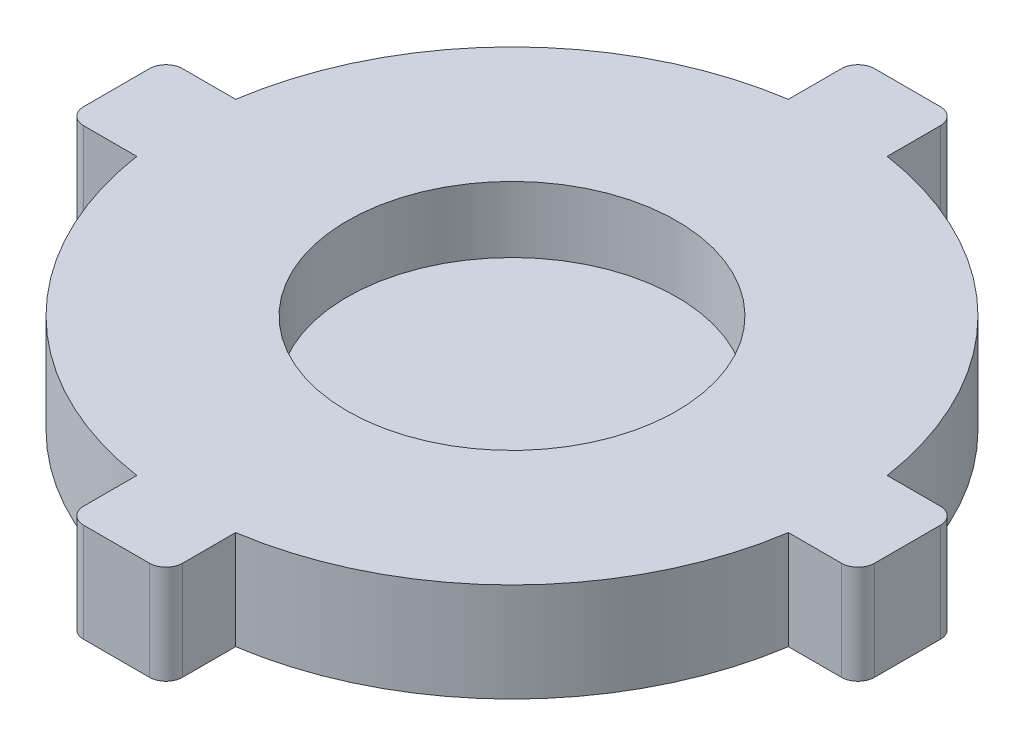
ISO-10303-21;
HEADER;
FILE_DESCRIPTION(('STEP AP214'),'2;1');
FILE_NAME('part.step','',(''),(''),'','','');
FILE_SCHEMA(('AUTOMOTIVE_DESIGN { 1 0 10303 214 1 1 1 1 }'));
ENDSEC;
DATA;
#1=APPLICATION_CONTEXT('core data for automotive mechanical design processes');
#2=APPLICATION_PROTOCOL_DEFINITION('international standard','automotive_design',2000,#1);
#3=PRODUCT_CONTEXT('',#1,'mechanical');
#4=PRODUCT('Part','Part','',(#3));
#5=PRODUCT_RELATED_PRODUCT_CATEGORY('part','',(#4));
#6=PRODUCT_DEFINITION_FORMATION('','',#4);
#7=PRODUCT_DEFINITION_CONTEXT('part definition',#1,'design');
#8=PRODUCT_DEFINITION('design','',#6,#7);
#9=PRODUCT_DEFINITION_SHAPE('','',#8);
#10=(LENGTH_UNIT() NAMED_UNIT(*) SI_UNIT(.MILLI.,.METRE.));
#11=(NAMED_UNIT(*) PLANE_ANGLE_UNIT() SI_UNIT($,.RADIAN.));
#12=(NAMED_UNIT(*) SI_UNIT($,.STERADIAN.) SOLID_ANGLE_UNIT());
#13=UNCERTAINTY_MEASURE_WITH_UNIT(LENGTH_MEASURE(1.E-05),#10,'distance_accuracy_value','');
#14=(GEOMETRIC_REPRESENTATION_CONTEXT(3) GLOBAL_UNCERTAINTY_ASSIGNED_CONTEXT((#13)) GLOBAL_UNIT_ASSIGNED_CONTEXT((#10,
#11,#12)) REPRESENTATION_CONTEXT('',''));
#15=CARTESIAN_POINT('',(0.,0.,0.));
#16=DIRECTION('',(0.,0.,1.));
#17=DIRECTION('',(1.,0.,0.));
#18=AXIS2_PLACEMENT_3D('',#15,#16,#17);
#19=CARTESIAN_POINT('',(0.,30.,0.));
#20=DIRECTION('',(0.,-1.,0.));
#21=DIRECTION('',(0.,0.,-1.));
#22=AXIS2_PLACEMENT_3D('',#19,#20,#21);
#23=CYLINDRICAL_SURFACE('',#22,100.);
#24=CARTESIAN_POINT('',(0.,0.,0.));
#25=DIRECTION('',(0.,1.,0.));
#26=DIRECTION('',(0.,0.,1.));
#27=AXIS2_PLACEMENT_3D('',#24,#25,#26);
#28=CIRCLE('',#27,100.);
#29=CARTESIAN_POINT('',(-98.8685996664261,0.,14.999999999999));
#30=VERTEX_POINT('',#29);
#31=CARTESIAN_POINT('',(-15.0000000000007,0.,98.8685996664259));
#32=VERTEX_POINT('',#31);
#33=EDGE_CURVE('E233',#30,#32,#28,.T.);
#34=ORIENTED_EDGE('',*,*,#33,.T.);
#35=DIRECTION('',(0.,-1.,0.));
#36=VECTOR('',#35,1.);
#37=CARTESIAN_POINT('',(-15.0000000000007,30.,98.8685996664259));
#38=LINE('',#37,#36);
#39=CARTESIAN_POINT('',(-15.0000000000007,30.,98.8685996664259));
#40=VERTEX_POINT('',#39);
#41=EDGE_CURVE('E45',#40,#32,#38,.T.);
#42=ORIENTED_EDGE('',*,*,#41,.F.);
#43=CARTESIAN_POINT('',(0.,30.,0.));
#44=DIRECTION('',(0.,1.,0.));
#45=DIRECTION('',(0.,0.,1.));
#46=AXIS2_PLACEMENT_3D('',#43,#44,#45);
#47=CIRCLE('',#46,100.);
#48=CARTESIAN_POINT('',(-98.8685996664261,30.,14.999999999999));
#49=VERTEX_POINT('',#48);
#50=EDGE_CURVE('E139',#49,#40,#47,.T.);
#51=ORIENTED_EDGE('',*,*,#50,.F.);
#52=DIRECTION('',(0.,-1.,0.));
#53=VECTOR('',#52,1.);
#54=CARTESIAN_POINT('',(-98.8685996664261,30.,14.999999999999));
#55=LINE('',#54,#53);
#56=EDGE_CURVE('E53',#49,#30,#55,.T.);
#57=ORIENTED_EDGE('',*,*,#56,.T.);
#58=EDGE_LOOP('',(#34,#42,#51,#57));
#59=FACE_BOUND('',#58,.T.);
#60=ADVANCED_FACE('F37',(#59),#23,.T.);
#61=CARTESIAN_POINT('',(-15.,30.,-1.02454893928513E-13));
#62=DIRECTION('',(-1.,0.,0.));
#63=DIRECTION('',(0.,0.,1.));
#64=AXIS2_PLACEMENT_3D('',#61,#62,#63);
#65=PLANE('',#64);
#66=DIRECTION('',(0.,0.,-1.));
#67=VECTOR('',#66,1.);
#68=CARTESIAN_POINT('',(-15.,0.,-1.02454893928513E-13));
#69=LINE('',#68,#67);
#70=CARTESIAN_POINT('',(-15.0000000000008,0.,115.));
#71=VERTEX_POINT('',#70);
#72=EDGE_CURVE('E235',#71,#32,#69,.T.);
#73=ORIENTED_EDGE('',*,*,#72,.F.);
#74=DIRECTION('',(0.,-1.,0.));
#75=VECTOR('',#74,1.);
#76=CARTESIAN_POINT('',(-15.0000000000008,30.,115.));
#77=LINE('',#76,#75);
#78=CARTESIAN_POINT('',(-15.0000000000008,30.,115.));
#79=VERTEX_POINT('',#78);
#80=EDGE_CURVE('E340',#79,#71,#77,.T.);
#81=ORIENTED_EDGE('',*,*,#80,.F.);
#82=DIRECTION('',(0.,0.,-1.));
#83=VECTOR('',#82,1.);
#84=CARTESIAN_POINT('',(-15.,30.,-1.02454893928513E-13));
#85=LINE('',#84,#83);
#86=EDGE_CURVE('E345',#79,#40,#85,.T.);
#87=ORIENTED_EDGE('',*,*,#86,.T.);
#88=ORIENTED_EDGE('',*,*,#41,.T.);
#89=EDGE_LOOP('',(#73,#81,#87,#88));
#90=FACE_BOUND('',#89,.T.);
#91=ADVANCED_FACE('F344',(#90),#65,.T.);
#92=CARTESIAN_POINT('',(-10.0000000000008,30.,115.));
#93=DIRECTION('',(0.,-1.,0.));
#94=DIRECTION('',(0.,0.,-1.));
#95=AXIS2_PLACEMENT_3D('',#92,#93,#94);
#96=CYLINDRICAL_SURFACE('',#95,5.);
#97=CARTESIAN_POINT('',(-10.0000000000008,0.,115.));
#98=DIRECTION('',(0.,1.,0.));
#99=DIRECTION('',(0.,0.,1.));
#100=AXIS2_PLACEMENT_3D('',#97,#98,#99);
#101=CIRCLE('',#100,5.);
#102=CARTESIAN_POINT('',(-10.0000000000008,0.,120.));
#103=VERTEX_POINT('',#102);
#104=EDGE_CURVE('E238',#103,#71,#101,.F.);
#105=ORIENTED_EDGE('',*,*,#104,.F.);
#106=DIRECTION('',(0.,-1.,0.));
#107=VECTOR('',#106,1.);
#108=CARTESIAN_POINT('',(-10.0000000000008,30.,120.));
#109=LINE('',#108,#107);
#110=CARTESIAN_POINT('',(-10.0000000000008,30.,120.));
#111=VERTEX_POINT('',#110);
#112=EDGE_CURVE('E338',#111,#103,#109,.T.);
#113=ORIENTED_EDGE('',*,*,#112,.F.);
#114=CARTESIAN_POINT('',(-10.0000000000008,30.,115.));
#115=DIRECTION('',(0.,1.,0.));
#116=DIRECTION('',(0.,0.,1.));
#117=AXIS2_PLACEMENT_3D('',#114,#115,#116);
#118=CIRCLE('',#117,5.);
#119=EDGE_CURVE('E354',#111,#79,#118,.F.);
#120=ORIENTED_EDGE('',*,*,#119,.T.);
#121=ORIENTED_EDGE('',*,*,#80,.T.);
#122=EDGE_LOOP('',(#105,#113,#120,#121));
#123=FACE_BOUND('',#122,.T.);
#124=ADVANCED_FACE('F351',(#123),#96,.T.);
#125=CARTESIAN_POINT('',(-8.32667268468871E-13,30.,120.));
#126=DIRECTION('',(0.,0.,1.));
#127=DIRECTION('',(1.,0.,0.));
#128=AXIS2_PLACEMENT_3D('',#125,#126,#127);
#129=PLANE('',#128);
#130=DIRECTION('',(-1.,0.,0.));
#131=VECTOR('',#130,1.);
#132=CARTESIAN_POINT('',(-8.32667268468871E-13,0.,120.));
#133=LINE('',#132,#131);
#134=CARTESIAN_POINT('',(9.99999999999912,0.,120.));
#135=VERTEX_POINT('',#134);
#136=EDGE_CURVE('E241',#135,#103,#133,.T.);
#137=ORIENTED_EDGE('',*,*,#136,.F.);
#138=DIRECTION('',(0.,-1.,0.));
#139=VECTOR('',#138,1.);
#140=CARTESIAN_POINT('',(9.99999999999912,30.,120.));
#141=LINE('',#140,#139);
#142=CARTESIAN_POINT('',(9.99999999999912,30.,120.));
#143=VERTEX_POINT('',#142);
#144=EDGE_CURVE('E336',#143,#135,#141,.T.);
#145=ORIENTED_EDGE('',*,*,#144,.F.);
#146=DIRECTION('',(-1.,0.,0.));
#147=VECTOR('',#146,1.);
#148=CARTESIAN_POINT('',(-8.32667268468871E-13,30.,120.));
#149=LINE('',#148,#147);
#150=EDGE_CURVE('E358',#143,#111,#149,.T.);
#151=ORIENTED_EDGE('',*,*,#150,.T.);
#152=ORIENTED_EDGE('',*,*,#112,.T.);
#153=EDGE_LOOP('',(#137,#145,#151,#152));
#154=FACE_BOUND('',#153,.T.);
#155=ADVANCED_FACE('F429',(#154),#129,.T.);
#156=CARTESIAN_POINT('',(9.99999999999919,30.,115.));
#157=DIRECTION('',(0.,-1.,0.));
#158=DIRECTION('',(0.,0.,-1.));
#159=AXIS2_PLACEMENT_3D('',#156,#157,#158);
#160=CYLINDRICAL_SURFACE('',#159,5.);
#161=CARTESIAN_POINT('',(9.99999999999919,0.,115.));
#162=DIRECTION('',(0.,1.,0.));
#163=DIRECTION('',(0.,0.,1.));
#164=AXIS2_PLACEMENT_3D('',#161,#162,#163);
#165=CIRCLE('',#164,5.);
#166=CARTESIAN_POINT('',(14.9999999999992,0.,115.));
#167=VERTEX_POINT('',#166);
#168=EDGE_CURVE('E244',#167,#135,#165,.F.);
#169=ORIENTED_EDGE('',*,*,#168,.F.);
#170=DIRECTION('',(0.,-1.,0.));
#171=VECTOR('',#170,1.);
#172=CARTESIAN_POINT('',(14.9999999999992,30.,115.));
#173=LINE('',#172,#171);
#174=CARTESIAN_POINT('',(14.9999999999992,30.,115.));
#175=VERTEX_POINT('',#174);
#176=EDGE_CURVE('E334',#175,#167,#173,.T.);
#177=ORIENTED_EDGE('',*,*,#176,.F.);
#178=CARTESIAN_POINT('',(9.99999999999919,30.,115.));
#179=DIRECTION('',(0.,1.,0.));
#180=DIRECTION('',(0.,0.,1.));
#181=AXIS2_PLACEMENT_3D('',#178,#179,#180);
#182=CIRCLE('',#181,5.);
#183=EDGE_CURVE('E363',#175,#143,#182,.F.);
#184=ORIENTED_EDGE('',*,*,#183,.T.);
#185=ORIENTED_EDGE('',*,*,#144,.T.);
#186=EDGE_LOOP('',(#169,#177,#184,#185));
#187=FACE_BOUND('',#186,.T.);
#188=ADVANCED_FACE('F434',(#187),#160,.T.);
#189=CARTESIAN_POINT('',(15.,30.,1.04774627375951E-13));
#190=DIRECTION('',(1.,0.,0.));
#191=DIRECTION('',(0.,0.,-1.));
#192=AXIS2_PLACEMENT_3D('',#189,#190,#191);
#193=PLANE('',#192);
#194=DIRECTION('',(0.,0.,1.));
#195=VECTOR('',#194,1.);
#196=CARTESIAN_POINT('',(15.,0.,1.04774627375951E-13));
#197=LINE('',#196,#195);
#198=CARTESIAN_POINT('',(14.9999999999993,0.,98.8685996664261));
#199=VERTEX_POINT('',#198);
#200=EDGE_CURVE('E247',#199,#167,#197,.T.);
#201=ORIENTED_EDGE('',*,*,#200,.F.);
#202=DIRECTION('',(0.,-1.,0.));
#203=VECTOR('',#202,1.);
#204=CARTESIAN_POINT('',(14.9999999999993,30.,98.8685996664261));
#205=LINE('',#204,#203);
#206=CARTESIAN_POINT('',(14.9999999999993,30.,98.8685996664261));
#207=VERTEX_POINT('',#206);
#208=EDGE_CURVE('E332',#207,#199,#205,.T.);
#209=ORIENTED_EDGE('',*,*,#208,.F.);
#210=DIRECTION('',(0.,0.,1.));
#211=VECTOR('',#210,1.);
#212=CARTESIAN_POINT('',(15.,30.,1.04774627375951E-13));
#213=LINE('',#212,#211);
#214=EDGE_CURVE('E366',#207,#175,#213,.T.);
#215=ORIENTED_EDGE('',*,*,#214,.T.);
#216=ORIENTED_EDGE('',*,*,#176,.T.);
#217=EDGE_LOOP('',(#201,#209,#215,#216));
#218=FACE_BOUND('',#217,.T.);
#219=ADVANCED_FACE('F438',(#218),#193,.T.);
#220=CARTESIAN_POINT('',(0.,30.,0.));
#221=DIRECTION('',(0.,-1.,0.));
#222=DIRECTION('',(0.,0.,-1.));
#223=AXIS2_PLACEMENT_3D('',#220,#221,#222);
#224=CYLINDRICAL_SURFACE('',#223,100.);
#225=CARTESIAN_POINT('',(0.,0.,0.));
#226=DIRECTION('',(0.,1.,0.));
#227=DIRECTION('',(0.,0.,1.));
#228=AXIS2_PLACEMENT_3D('',#225,#226,#227);
#229=CIRCLE('',#228,100.);
#230=CARTESIAN_POINT('',(98.8685996664259,0.,15.0000000000003));
#231=VERTEX_POINT('',#230);
#232=EDGE_CURVE('E250',#199,#231,#229,.T.);
#233=ORIENTED_EDGE('',*,*,#232,.T.);
#234=DIRECTION('',(0.,-1.,0.));
#235=VECTOR('',#234,1.);
#236=CARTESIAN_POINT('',(98.8685996664259,30.,15.0000000000003));
#237=LINE('',#236,#235);
#238=CARTESIAN_POINT('',(98.8685996664259,30.,15.0000000000003));
#239=VERTEX_POINT('',#238);
#240=EDGE_CURVE('E330',#239,#231,#237,.T.);
#241=ORIENTED_EDGE('',*,*,#240,.F.);
#242=CARTESIAN_POINT('',(0.,30.,0.));
#243=DIRECTION('',(0.,1.,0.));
#244=DIRECTION('',(0.,0.,1.));
#245=AXIS2_PLACEMENT_3D('',#242,#243,#244);
#246=CIRCLE('',#245,100.);
#247=EDGE_CURVE('E369',#207,#239,#246,.T.);
#248=ORIENTED_EDGE('',*,*,#247,.F.);
#249=ORIENTED_EDGE('',*,*,#208,.T.);
#250=EDGE_LOOP('',(#233,#241,#248,#249));
#251=FACE_BOUND('',#250,.T.);
#252=ADVANCED_FACE('F442',(#251),#224,.T.);
#253=CARTESIAN_POINT('',(0.,30.,15.));
#254=DIRECTION('',(0.,0.,1.));
#255=DIRECTION('',(1.,0.,0.));
#256=AXIS2_PLACEMENT_3D('',#253,#254,#255);
#257=PLANE('',#256);
#258=DIRECTION('',(-1.,0.,0.));
#259=VECTOR('',#258,1.);
#260=CARTESIAN_POINT('',(0.,0.,15.));
#261=LINE('',#260,#259);
#262=CARTESIAN_POINT('',(115.,0.,15.0000000000004));
#263=VERTEX_POINT('',#262);
#264=EDGE_CURVE('E253',#263,#231,#261,.T.);
#265=ORIENTED_EDGE('',*,*,#264,.F.);
#266=DIRECTION('',(0.,-1.,0.));
#267=VECTOR('',#266,1.);
#268=CARTESIAN_POINT('',(115.,30.,15.0000000000004));
#269=LINE('',#268,#267);
#270=CARTESIAN_POINT('',(115.,30.,15.0000000000004));
#271=VERTEX_POINT('',#270);
#272=EDGE_CURVE('E328',#271,#263,#269,.T.);
#273=ORIENTED_EDGE('',*,*,#272,.F.);
#274=DIRECTION('',(-1.,0.,0.));
#275=VECTOR('',#274,1.);
#276=CARTESIAN_POINT('',(0.,30.,15.));
#277=LINE('',#276,#275);
#278=EDGE_CURVE('E371',#271,#239,#277,.T.);
#279=ORIENTED_EDGE('',*,*,#278,.T.);
#280=ORIENTED_EDGE('',*,*,#240,.T.);
#281=EDGE_LOOP('',(#265,#273,#279,#280));
#282=FACE_BOUND('',#281,.T.);
#283=ADVANCED_FACE('F446',(#282),#257,.T.);
#284=CARTESIAN_POINT('',(115.,30.,10.0000000000004));
#285=DIRECTION('',(0.,-1.,0.));
#286=DIRECTION('',(0.,0.,-1.));
#287=AXIS2_PLACEMENT_3D('',#284,#285,#286);
#288=CYLINDRICAL_SURFACE('',#287,5.);
#289=CARTESIAN_POINT('',(115.,0.,10.0000000000004));
#290=DIRECTION('',(0.,1.,0.));
#291=DIRECTION('',(0.,0.,1.));
#292=AXIS2_PLACEMENT_3D('',#289,#290,#291);
#293=CIRCLE('',#292,5.);
#294=CARTESIAN_POINT('',(120.,0.,10.0000000000004));
#295=VERTEX_POINT('',#294);
#296=EDGE_CURVE('E256',#295,#263,#293,.F.);
#297=ORIENTED_EDGE('',*,*,#296,.F.);
#298=DIRECTION('',(0.,-1.,0.));
#299=VECTOR('',#298,1.);
#300=CARTESIAN_POINT('',(120.,30.,10.0000000000004));
#301=LINE('',#300,#299);
#302=CARTESIAN_POINT('',(120.,30.,10.0000000000004));
#303=VERTEX_POINT('',#302);
#304=EDGE_CURVE('E326',#303,#295,#301,.T.);
#305=ORIENTED_EDGE('',*,*,#304,.F.);
#306=CARTESIAN_POINT('',(115.,30.,10.0000000000004));
#307=DIRECTION('',(0.,1.,0.));
#308=DIRECTION('',(0.,0.,1.));
#309=AXIS2_PLACEMENT_3D('',#306,#307,#308);
#310=CIRCLE('',#309,5.);
#311=EDGE_CURVE('E374',#303,#271,#310,.F.);
#312=ORIENTED_EDGE('',*,*,#311,.T.);
#313=ORIENTED_EDGE('',*,*,#272,.T.);
#314=EDGE_LOOP('',(#297,#305,#312,#313));
#315=FACE_BOUND('',#314,.T.);
#316=ADVANCED_FACE('F450',(#315),#288,.T.);
#317=CARTESIAN_POINT('',(120.,30.,4.99600361081323E-13));
#318=DIRECTION('',(1.,0.,0.));
#319=DIRECTION('',(0.,0.,-1.));
#320=AXIS2_PLACEMENT_3D('',#317,#318,#319);
#321=PLANE('',#320);
#322=DIRECTION('',(0.,0.,1.));
#323=VECTOR('',#322,1.);
#324=CARTESIAN_POINT('',(120.,0.,4.99600361081323E-13));
#325=LINE('',#324,#323);
#326=CARTESIAN_POINT('',(120.,0.,-9.99999999999954));
#327=VERTEX_POINT('',#326);
#328=EDGE_CURVE('E259',#327,#295,#325,.T.);
#329=ORIENTED_EDGE('',*,*,#328,.F.);
#330=DIRECTION('',(0.,-1.,0.));
#331=VECTOR('',#330,1.);
#332=CARTESIAN_POINT('',(120.,30.,-9.99999999999954));
#333=LINE('',#332,#331);
#334=CARTESIAN_POINT('',(120.,30.,-9.99999999999954));
#335=VERTEX_POINT('',#334);
#336=EDGE_CURVE('E324',#335,#327,#333,.T.);
#337=ORIENTED_EDGE('',*,*,#336,.F.);
#338=DIRECTION('',(0.,0.,1.));
#339=VECTOR('',#338,1.);
#340=CARTESIAN_POINT('',(120.,30.,4.99600361081323E-13));
#341=LINE('',#340,#339);
#342=EDGE_CURVE('E377',#335,#303,#341,.T.);
#343=ORIENTED_EDGE('',*,*,#342,.T.);
#344=ORIENTED_EDGE('',*,*,#304,.T.);
#345=EDGE_LOOP('',(#329,#337,#343,#344));
#346=FACE_BOUND('',#345,.T.);
#347=ADVANCED_FACE('F454',(#346),#321,.T.);
#348=CARTESIAN_POINT('',(115.,30.,-9.99999999999959));
#349=DIRECTION('',(0.,-1.,0.));
#350=DIRECTION('',(0.,0.,-1.));
#351=AXIS2_PLACEMENT_3D('',#348,#349,#350);
#352=CYLINDRICAL_SURFACE('',#351,5.);
#353=CARTESIAN_POINT('',(115.,0.,-9.99999999999959));
#354=DIRECTION('',(0.,1.,0.));
#355=DIRECTION('',(0.,0.,1.));
#356=AXIS2_PLACEMENT_3D('',#353,#354,#355);
#357=CIRCLE('',#356,5.);
#358=CARTESIAN_POINT('',(115.,0.,-14.9999999999996));
#359=VERTEX_POINT('',#358);
#360=EDGE_CURVE('E262',#359,#327,#357,.F.);
#361=ORIENTED_EDGE('',*,*,#360,.F.);
#362=DIRECTION('',(0.,-1.,0.));
#363=VECTOR('',#362,1.);
#364=CARTESIAN_POINT('',(115.,30.,-14.9999999999996));
#365=LINE('',#364,#363);
#366=CARTESIAN_POINT('',(115.,30.,-14.9999999999996));
#367=VERTEX_POINT('',#366);
#368=EDGE_CURVE('E322',#367,#359,#365,.T.);
#369=ORIENTED_EDGE('',*,*,#368,.F.);
#370=CARTESIAN_POINT('',(115.,30.,-9.99999999999959));
#371=DIRECTION('',(0.,1.,0.));
#372=DIRECTION('',(0.,0.,1.));
#373=AXIS2_PLACEMENT_3D('',#370,#371,#372);
#374=CIRCLE('',#373,5.);
#375=EDGE_CURVE('E380',#367,#335,#374,.F.);
#376=ORIENTED_EDGE('',*,*,#375,.T.);
#377=ORIENTED_EDGE('',*,*,#336,.T.);
#378=EDGE_LOOP('',(#361,#369,#376,#377));
#379=FACE_BOUND('',#378,.T.);
#380=ADVANCED_FACE('F458',(#379),#352,.T.);
#381=CARTESIAN_POINT('',(0.,30.,-15.));
#382=DIRECTION('',(0.,0.,-1.));
#383=DIRECTION('',(-1.,0.,0.));
#384=AXIS2_PLACEMENT_3D('',#381,#382,#383);
#385=PLANE('',#384);
#386=DIRECTION('',(1.,0.,0.));
#387=VECTOR('',#386,1.);
#388=CARTESIAN_POINT('',(0.,0.,-15.));
#389=LINE('',#388,#387);
#390=CARTESIAN_POINT('',(98.868599666426,0.,-14.9999999999996));
#391=VERTEX_POINT('',#390);
#392=EDGE_CURVE('E265',#391,#359,#389,.T.);
#393=ORIENTED_EDGE('',*,*,#392,.F.);
#394=DIRECTION('',(0.,-1.,0.));
#395=VECTOR('',#394,1.);
#396=CARTESIAN_POINT('',(98.868599666426,30.,-14.9999999999996));
#397=LINE('',#396,#395);
#398=CARTESIAN_POINT('',(98.868599666426,30.,-14.9999999999996));
#399=VERTEX_POINT('',#398);
#400=EDGE_CURVE('E320',#399,#391,#397,.T.);
#401=ORIENTED_EDGE('',*,*,#400,.F.);
#402=DIRECTION('',(1.,0.,0.));
#403=VECTOR('',#402,1.);
#404=CARTESIAN_POINT('',(0.,30.,-15.));
#405=LINE('',#404,#403);
#406=EDGE_CURVE('E383',#399,#367,#405,.T.);
#407=ORIENTED_EDGE('',*,*,#406,.T.);
#408=ORIENTED_EDGE('',*,*,#368,.T.);
#409=EDGE_LOOP('',(#393,#401,#407,#408));
#410=FACE_BOUND('',#409,.T.);
#411=ADVANCED_FACE('F462',(#410),#385,.T.);
#412=CARTESIAN_POINT('',(0.,30.,0.));
#413=DIRECTION('',(0.,-1.,0.));
#414=DIRECTION('',(0.,0.,-1.));
#415=AXIS2_PLACEMENT_3D('',#412,#413,#414);
#416=CYLINDRICAL_SURFACE('',#415,100.);
#417=CARTESIAN_POINT('',(0.,0.,0.));
#418=DIRECTION('',(0.,1.,0.));
#419=DIRECTION('',(0.,0.,1.));
#420=AXIS2_PLACEMENT_3D('',#417,#418,#419);
#421=CIRCLE('',#420,100.);
#422=CARTESIAN_POINT('',(15.,0.,-98.868599666426));
#423=VERTEX_POINT('',#422);
#424=EDGE_CURVE('E268',#391,#423,#421,.T.);
#425=ORIENTED_EDGE('',*,*,#424,.T.);
#426=DIRECTION('',(0.,-1.,0.));
#427=VECTOR('',#426,1.);
#428=CARTESIAN_POINT('',(15.,30.,-98.868599666426));
#429=LINE('',#428,#427);
#430=CARTESIAN_POINT('',(15.,30.,-98.868599666426));
#431=VERTEX_POINT('',#430);
#432=EDGE_CURVE('E318',#431,#423,#429,.T.);
#433=ORIENTED_EDGE('',*,*,#432,.F.);
#434=CARTESIAN_POINT('',(0.,30.,0.));
#435=DIRECTION('',(0.,1.,0.));
#436=DIRECTION('',(0.,0.,1.));
#437=AXIS2_PLACEMENT_3D('',#434,#435,#436);
#438=CIRCLE('',#437,100.);
#439=EDGE_CURVE('E386',#399,#431,#438,.T.);
#440=ORIENTED_EDGE('',*,*,#439,.F.);
#441=ORIENTED_EDGE('',*,*,#400,.T.);
#442=EDGE_LOOP('',(#425,#433,#440,#441));
#443=FACE_BOUND('',#442,.T.);
#444=ADVANCED_FACE('F466',(#443),#416,.T.);
#445=CARTESIAN_POINT('',(15.,30.,0.));
#446=DIRECTION('',(1.,0.,0.));
#447=DIRECTION('',(0.,0.,-1.));
#448=AXIS2_PLACEMENT_3D('',#445,#446,#447);
#449=PLANE('',#448);
#450=DIRECTION('',(0.,0.,1.));
#451=VECTOR('',#450,1.);
#452=CARTESIAN_POINT('',(15.,0.,0.));
#453=LINE('',#452,#451);
#454=CARTESIAN_POINT('',(15.,0.,-115.));
#455=VERTEX_POINT('',#454);
#456=EDGE_CURVE('E271',#455,#423,#453,.T.);
#457=ORIENTED_EDGE('',*,*,#456,.F.);
#458=DIRECTION('',(0.,-1.,0.));
#459=VECTOR('',#458,1.);
#460=CARTESIAN_POINT('',(15.,30.,-115.));
#461=LINE('',#460,#459);
#462=CARTESIAN_POINT('',(15.,30.,-115.));
#463=VERTEX_POINT('',#462);
#464=EDGE_CURVE('E316',#463,#455,#461,.T.);
#465=ORIENTED_EDGE('',*,*,#464,.F.);
#466=DIRECTION('',(0.,0.,1.));
#467=VECTOR('',#466,1.);
#468=CARTESIAN_POINT('',(15.,30.,0.));
#469=LINE('',#468,#467);
#470=EDGE_CURVE('E388',#463,#431,#469,.T.);
#471=ORIENTED_EDGE('',*,*,#470,.T.);
#472=ORIENTED_EDGE('',*,*,#432,.T.);
#473=EDGE_LOOP('',(#457,#465,#471,#472));
#474=FACE_BOUND('',#473,.T.);
#475=ADVANCED_FACE('F470',(#474),#449,.T.);
#476=CARTESIAN_POINT('',(10.,30.,-115.));
#477=DIRECTION('',(0.,-1.,0.));
#478=DIRECTION('',(0.,0.,-1.));
#479=AXIS2_PLACEMENT_3D('',#476,#477,#478);
#480=CYLINDRICAL_SURFACE('',#479,5.);
#481=CARTESIAN_POINT('',(10.,0.,-115.));
#482=DIRECTION('',(0.,1.,0.));
#483=DIRECTION('',(0.,0.,1.));
#484=AXIS2_PLACEMENT_3D('',#481,#482,#483);
#485=CIRCLE('',#484,5.);
#486=CARTESIAN_POINT('',(9.99999999999996,0.,-120.));
#487=VERTEX_POINT('',#486);
#488=EDGE_CURVE('E274',#487,#455,#485,.F.);
#489=ORIENTED_EDGE('',*,*,#488,.F.);
#490=DIRECTION('',(0.,-1.,0.));
#491=VECTOR('',#490,1.);
#492=CARTESIAN_POINT('',(9.99999999999996,30.,-120.));
#493=LINE('',#492,#491);
#494=CARTESIAN_POINT('',(9.99999999999996,30.,-120.));
#495=VERTEX_POINT('',#494);
#496=EDGE_CURVE('E314',#495,#487,#493,.T.);
#497=ORIENTED_EDGE('',*,*,#496,.F.);
#498=CARTESIAN_POINT('',(10.,30.,-115.));
#499=DIRECTION('',(0.,1.,0.));
#500=DIRECTION('',(0.,0.,1.));
#501=AXIS2_PLACEMENT_3D('',#498,#499,#500);
#502=CIRCLE('',#501,5.);
#503=EDGE_CURVE('E391',#495,#463,#502,.F.);
#504=ORIENTED_EDGE('',*,*,#503,.T.);
#505=ORIENTED_EDGE('',*,*,#464,.T.);
#506=EDGE_LOOP('',(#489,#497,#504,#505));
#507=FACE_BOUND('',#506,.T.);
#508=ADVANCED_FACE('F474',(#507),#480,.T.);
#509=CARTESIAN_POINT('',(0.,30.,-120.));
#510=DIRECTION('',(0.,0.,-1.));
#511=DIRECTION('',(-1.,0.,0.));
#512=AXIS2_PLACEMENT_3D('',#509,#510,#511);
#513=PLANE('',#512);
#514=DIRECTION('',(1.,0.,0.));
#515=VECTOR('',#514,1.);
#516=CARTESIAN_POINT('',(0.,0.,-120.));
#517=LINE('',#516,#515);
#518=CARTESIAN_POINT('',(-9.99999999999996,0.,-120.));
#519=VERTEX_POINT('',#518);
#520=EDGE_CURVE('E277',#519,#487,#517,.T.);
#521=ORIENTED_EDGE('',*,*,#520,.F.);
#522=DIRECTION('',(0.,-1.,0.));
#523=VECTOR('',#522,1.);
#524=CARTESIAN_POINT('',(-9.99999999999996,30.,-120.));
#525=LINE('',#524,#523);
#526=CARTESIAN_POINT('',(-9.99999999999996,30.,-120.));
#527=VERTEX_POINT('',#526);
#528=EDGE_CURVE('E312',#527,#519,#525,.T.);
#529=ORIENTED_EDGE('',*,*,#528,.F.);
#530=DIRECTION('',(1.,0.,0.));
#531=VECTOR('',#530,1.);
#532=CARTESIAN_POINT('',(0.,30.,-120.));
#533=LINE('',#532,#531);
#534=EDGE_CURVE('E394',#527,#495,#533,.T.);
#535=ORIENTED_EDGE('',*,*,#534,.T.);
#536=ORIENTED_EDGE('',*,*,#496,.T.);
#537=EDGE_LOOP('',(#521,#529,#535,#536));
#538=FACE_BOUND('',#537,.T.);
#539=ADVANCED_FACE('F478',(#538),#513,.T.);
#540=CARTESIAN_POINT('',(-9.99999999999999,30.,-115.));
#541=DIRECTION('',(0.,-1.,0.));
#542=DIRECTION('',(0.,0.,-1.));
#543=AXIS2_PLACEMENT_3D('',#540,#541,#542);
#544=CYLINDRICAL_SURFACE('',#543,5.);
#545=CARTESIAN_POINT('',(-9.99999999999999,0.,-115.));
#546=DIRECTION('',(0.,1.,0.));
#547=DIRECTION('',(0.,0.,1.));
#548=AXIS2_PLACEMENT_3D('',#545,#546,#547);
#549=CIRCLE('',#548,5.);
#550=CARTESIAN_POINT('',(-15.,0.,-115.));
#551=VERTEX_POINT('',#550);
#552=EDGE_CURVE('E280',#551,#519,#549,.F.);
#553=ORIENTED_EDGE('',*,*,#552,.F.);
#554=DIRECTION('',(0.,-1.,0.));
#555=VECTOR('',#554,1.);
#556=CARTESIAN_POINT('',(-15.,30.,-115.));
#557=LINE('',#556,#555);
#558=CARTESIAN_POINT('',(-15.,30.,-115.));
#559=VERTEX_POINT('',#558);
#560=EDGE_CURVE('E310',#559,#551,#557,.T.);
#561=ORIENTED_EDGE('',*,*,#560,.F.);
#562=CARTESIAN_POINT('',(-9.99999999999999,30.,-115.));
#563=DIRECTION('',(0.,1.,0.));
#564=DIRECTION('',(0.,0.,1.));
#565=AXIS2_PLACEMENT_3D('',#562,#563,#564);
#566=CIRCLE('',#565,5.);
#567=EDGE_CURVE('E397',#559,#527,#566,.F.);
#568=ORIENTED_EDGE('',*,*,#567,.T.);
#569=ORIENTED_EDGE('',*,*,#528,.T.);
#570=EDGE_LOOP('',(#553,#561,#568,#569));
#571=FACE_BOUND('',#570,.T.);
#572=ADVANCED_FACE('F482',(#571),#544,.T.);
#573=CARTESIAN_POINT('',(-15.,30.,0.));
#574=DIRECTION('',(-1.,0.,0.));
#575=DIRECTION('',(0.,0.,1.));
#576=AXIS2_PLACEMENT_3D('',#573,#574,#575);
#577=PLANE('',#576);
#578=DIRECTION('',(0.,0.,-1.));
#579=VECTOR('',#578,1.);
#580=CARTESIAN_POINT('',(-15.,0.,0.));
#581=LINE('',#580,#579);
#582=CARTESIAN_POINT('',(-15.,0.,-98.868599666426));
#583=VERTEX_POINT('',#582);
#584=EDGE_CURVE('E283',#583,#551,#581,.T.);
#585=ORIENTED_EDGE('',*,*,#584,.F.);
#586=DIRECTION('',(0.,-1.,0.));
#587=VECTOR('',#586,1.);
#588=CARTESIAN_POINT('',(-15.,30.,-98.868599666426));
#589=LINE('',#588,#587);
#590=CARTESIAN_POINT('',(-15.,30.,-98.868599666426));
#591=VERTEX_POINT('',#590);
#592=EDGE_CURVE('E308',#591,#583,#589,.T.);
#593=ORIENTED_EDGE('',*,*,#592,.F.);
#594=DIRECTION('',(0.,0.,-1.));
#595=VECTOR('',#594,1.);
#596=CARTESIAN_POINT('',(-15.,30.,0.));
#597=LINE('',#596,#595);
#598=EDGE_CURVE('E400',#591,#559,#597,.T.);
#599=ORIENTED_EDGE('',*,*,#598,.T.);
#600=ORIENTED_EDGE('',*,*,#560,.T.);
#601=EDGE_LOOP('',(#585,#593,#599,#600));
#602=FACE_BOUND('',#601,.T.);
#603=ADVANCED_FACE('F486',(#602),#577,.T.);
#604=CARTESIAN_POINT('',(0.,30.,0.));
#605=DIRECTION('',(0.,-1.,0.));
#606=DIRECTION('',(0.,0.,-1.));
#607=AXIS2_PLACEMENT_3D('',#604,#605,#606);
#608=CYLINDRICAL_SURFACE('',#607,100.);
#609=CARTESIAN_POINT('',(0.,0.,0.));
#610=DIRECTION('',(0.,1.,0.));
#611=DIRECTION('',(0.,0.,1.));
#612=AXIS2_PLACEMENT_3D('',#609,#610,#611);
#613=CIRCLE('',#612,100.);
#614=CARTESIAN_POINT('',(-98.8685996664258,0.,-15.000000000001));
#615=VERTEX_POINT('',#614);
#616=EDGE_CURVE('E286',#583,#615,#613,.T.);
#617=ORIENTED_EDGE('',*,*,#616,.T.);
#618=DIRECTION('',(0.,-1.,0.));
#619=VECTOR('',#618,1.);
#620=CARTESIAN_POINT('',(-98.8685996664258,30.,-15.000000000001));
#621=LINE('',#620,#619);
#622=CARTESIAN_POINT('',(-98.8685996664258,30.,-15.000000000001));
#623=VERTEX_POINT('',#622);
#624=EDGE_CURVE('E306',#623,#615,#621,.T.);
#625=ORIENTED_EDGE('',*,*,#624,.F.);
#626=CARTESIAN_POINT('',(0.,30.,0.));
#627=DIRECTION('',(0.,1.,0.));
#628=DIRECTION('',(0.,0.,1.));
#629=AXIS2_PLACEMENT_3D('',#626,#627,#628);
#630=CIRCLE('',#629,100.);
#631=EDGE_CURVE('E403',#591,#623,#630,.T.);
#632=ORIENTED_EDGE('',*,*,#631,.F.);
#633=ORIENTED_EDGE('',*,*,#592,.T.);
#634=EDGE_LOOP('',(#617,#625,#632,#633));
#635=FACE_BOUND('',#634,.T.);
#636=ADVANCED_FACE('F490',(#635),#608,.T.);
#637=CARTESIAN_POINT('',(1.54648896495869E-13,30.,-15.));
#638=DIRECTION('',(0.,0.,-1.));
#639=DIRECTION('',(-1.,0.,0.));
#640=AXIS2_PLACEMENT_3D('',#637,#638,#639);
#641=PLANE('',#640);
#642=DIRECTION('',(1.,0.,0.));
#643=VECTOR('',#642,1.);
#644=CARTESIAN_POINT('',(1.54648896495869E-13,0.,-15.));
#645=LINE('',#644,#643);
#646=CARTESIAN_POINT('',(-115.,0.,-15.0000000000012));
#647=VERTEX_POINT('',#646);
#648=EDGE_CURVE('E289',#647,#615,#645,.T.);
#649=ORIENTED_EDGE('',*,*,#648,.F.);
#650=DIRECTION('',(0.,-1.,0.));
#651=VECTOR('',#650,1.);
#652=CARTESIAN_POINT('',(-115.,30.,-15.0000000000012));
#653=LINE('',#652,#651);
#654=CARTESIAN_POINT('',(-115.,30.,-15.0000000000012));
#655=VERTEX_POINT('',#654);
#656=EDGE_CURVE('E304',#655,#647,#653,.T.);
#657=ORIENTED_EDGE('',*,*,#656,.F.);
#658=DIRECTION('',(1.,0.,0.));
#659=VECTOR('',#658,1.);
#660=CARTESIAN_POINT('',(1.54648896495869E-13,30.,-15.));
#661=LINE('',#660,#659);
#662=EDGE_CURVE('E405',#655,#623,#661,.T.);
#663=ORIENTED_EDGE('',*,*,#662,.T.);
#664=ORIENTED_EDGE('',*,*,#624,.T.);
#665=EDGE_LOOP('',(#649,#657,#663,#664));
#666=FACE_BOUND('',#665,.T.);
#667=ADVANCED_FACE('F494',(#666),#641,.T.);
#668=CARTESIAN_POINT('',(-115.,30.,-10.0000000000012));
#669=DIRECTION('',(0.,-1.,0.));
#670=DIRECTION('',(0.,0.,-1.));
#671=AXIS2_PLACEMENT_3D('',#668,#669,#670);
#672=CYLINDRICAL_SURFACE('',#671,5.);
#673=CARTESIAN_POINT('',(-115.,0.,-10.0000000000012));
#674=DIRECTION('',(0.,1.,0.));
#675=DIRECTION('',(0.,0.,1.));
#676=AXIS2_PLACEMENT_3D('',#673,#674,#675);
#677=CIRCLE('',#676,5.);
#678=CARTESIAN_POINT('',(-120.,0.,-10.0000000000012));
#679=VERTEX_POINT('',#678);
#680=EDGE_CURVE('E292',#679,#647,#677,.F.);
#681=ORIENTED_EDGE('',*,*,#680,.F.);
#682=DIRECTION('',(0.,-1.,0.));
#683=VECTOR('',#682,1.);
#684=CARTESIAN_POINT('',(-120.,30.,-10.0000000000012));
#685=LINE('',#684,#683);
#686=CARTESIAN_POINT('',(-120.,30.,-10.0000000000012));
#687=VERTEX_POINT('',#686);
#688=EDGE_CURVE('E213',#687,#679,#685,.T.);
#689=ORIENTED_EDGE('',*,*,#688,.F.);
#690=CARTESIAN_POINT('',(-115.,30.,-10.0000000000012));
#691=DIRECTION('',(0.,1.,0.));
#692=DIRECTION('',(0.,0.,1.));
#693=AXIS2_PLACEMENT_3D('',#690,#691,#692);
#694=CIRCLE('',#693,5.);
#695=EDGE_CURVE('E222',#687,#655,#694,.F.);
#696=ORIENTED_EDGE('',*,*,#695,.T.);
#697=ORIENTED_EDGE('',*,*,#656,.T.);
#698=EDGE_LOOP('',(#681,#689,#696,#697));
#699=FACE_BOUND('',#698,.T.);
#700=ADVANCED_FACE('F409',(#699),#672,.T.);
#701=CARTESIAN_POINT('',(-120.,30.,-1.33226762955019E-12));
#702=DIRECTION('',(-1.,0.,0.));
#703=DIRECTION('',(0.,0.,1.));
#704=AXIS2_PLACEMENT_3D('',#701,#702,#703);
#705=PLANE('',#704);
#706=DIRECTION('',(0.,0.,-1.));
#707=VECTOR('',#706,1.);
#708=CARTESIAN_POINT('',(-120.,0.,-1.33226762955019E-12));
#709=LINE('',#708,#707);
#710=CARTESIAN_POINT('',(-120.,0.,9.9999999999987));
#711=VERTEX_POINT('',#710);
#712=EDGE_CURVE('E209',#711,#679,#709,.T.);
#713=ORIENTED_EDGE('',*,*,#712,.F.);
#714=DIRECTION('',(0.,-1.,0.));
#715=VECTOR('',#714,1.);
#716=CARTESIAN_POINT('',(-120.,30.,9.9999999999987));
#717=LINE('',#716,#715);
#718=CARTESIAN_POINT('',(-120.,30.,9.9999999999987));
#719=VERTEX_POINT('',#718);
#720=EDGE_CURVE('E204',#719,#711,#717,.T.);
#721=ORIENTED_EDGE('',*,*,#720,.F.);
#722=DIRECTION('',(0.,0.,-1.));
#723=VECTOR('',#722,1.);
#724=CARTESIAN_POINT('',(-120.,30.,-1.33226762955019E-12));
#725=LINE('',#724,#723);
#726=EDGE_CURVE('E207',#719,#687,#725,.T.);
#727=ORIENTED_EDGE('',*,*,#726,.T.);
#728=ORIENTED_EDGE('',*,*,#688,.T.);
#729=EDGE_LOOP('',(#713,#721,#727,#728));
#730=FACE_BOUND('',#729,.T.);
#731=ADVANCED_FACE('F206',(#730),#705,.T.);
#732=CARTESIAN_POINT('',(-115.,30.,9.99999999999879));
#733=DIRECTION('',(0.,-1.,0.));
#734=DIRECTION('',(0.,0.,-1.));
#735=AXIS2_PLACEMENT_3D('',#732,#733,#734);
#736=CYLINDRICAL_SURFACE('',#735,5.);
#737=CARTESIAN_POINT('',(-115.,0.,9.99999999999879));
#738=DIRECTION('',(0.,1.,0.));
#739=DIRECTION('',(0.,0.,1.));
#740=AXIS2_PLACEMENT_3D('',#737,#738,#739);
#741=CIRCLE('',#740,5.);
#742=CARTESIAN_POINT('',(-115.,0.,14.9999999999988));
#743=VERTEX_POINT('',#742);
#744=EDGE_CURVE('E296',#743,#711,#741,.F.);
#745=ORIENTED_EDGE('',*,*,#744,.F.);
#746=DIRECTION('',(0.,-1.,0.));
#747=VECTOR('',#746,1.);
#748=CARTESIAN_POINT('',(-115.,30.,14.9999999999988));
#749=LINE('',#748,#747);
#750=CARTESIAN_POINT('',(-115.,30.,14.9999999999988));
#751=VERTEX_POINT('',#750);
#752=EDGE_CURVE('E127',#751,#743,#749,.T.);
#753=ORIENTED_EDGE('',*,*,#752,.F.);
#754=CARTESIAN_POINT('',(-115.,30.,9.99999999999879));
#755=DIRECTION('',(0.,1.,0.));
#756=DIRECTION('',(0.,0.,1.));
#757=AXIS2_PLACEMENT_3D('',#754,#755,#756);
#758=CIRCLE('',#757,5.);
#759=EDGE_CURVE('E219',#751,#719,#758,.F.);
#760=ORIENTED_EDGE('',*,*,#759,.T.);
#761=ORIENTED_EDGE('',*,*,#720,.T.);
#762=EDGE_LOOP('',(#745,#753,#760,#761));
#763=FACE_BOUND('',#762,.T.);
#764=ADVANCED_FACE('F224',(#763),#736,.T.);
#765=CARTESIAN_POINT('',(-1.56968629943307E-13,30.,15.));
#766=DIRECTION('',(0.,0.,1.));
#767=DIRECTION('',(1.,0.,0.));
#768=AXIS2_PLACEMENT_3D('',#765,#766,#767);
#769=PLANE('',#768);
#770=DIRECTION('',(-1.,0.,0.));
#771=VECTOR('',#770,1.);
#772=CARTESIAN_POINT('',(-1.56968629943307E-13,0.,15.));
#773=LINE('',#772,#771);
#774=EDGE_CURVE('E298',#30,#743,#773,.T.);
#775=ORIENTED_EDGE('',*,*,#774,.F.);
#776=ORIENTED_EDGE('',*,*,#56,.F.);
#777=DIRECTION('',(-1.,0.,0.));
#778=VECTOR('',#777,1.);
#779=CARTESIAN_POINT('',(-1.56968629943307E-13,30.,15.));
#780=LINE('',#779,#778);
#781=EDGE_CURVE('E225',#49,#751,#780,.T.);
#782=ORIENTED_EDGE('',*,*,#781,.T.);
#783=ORIENTED_EDGE('',*,*,#752,.T.);
#784=EDGE_LOOP('',(#775,#776,#782,#783));
#785=FACE_BOUND('',#784,.T.);
#786=ADVANCED_FACE('F411',(#785),#769,.T.);
#787=CARTESIAN_POINT('',(0.,30.,0.));
#788=DIRECTION('',(0.,-1.,0.));
#789=DIRECTION('',(0.,0.,-1.));
#790=AXIS2_PLACEMENT_3D('',#787,#788,#789);
#791=CYLINDRICAL_SURFACE('',#790,50.);
#792=CARTESIAN_POINT('',(0.,10.,0.));
#793=DIRECTION('',(0.,1.,0.));
#794=DIRECTION('',(0.,0.,1.));
#795=AXIS2_PLACEMENT_3D('',#792,#793,#794);
#796=CIRCLE('',#795,50.);
#797=CARTESIAN_POINT('',(0.,10.,50.));
#798=VERTEX_POINT('',#797);
#799=EDGE_CURVE('E12',#798,#798,#796,.T.);
#800=ORIENTED_EDGE('',*,*,#799,.F.);
#801=EDGE_LOOP('',(#800));
#802=FACE_BOUND('',#801,.T.);
#803=CARTESIAN_POINT('',(0.,30.,0.));
#804=DIRECTION('',(0.,1.,0.));
#805=DIRECTION('',(0.,0.,1.));
#806=AXIS2_PLACEMENT_3D('',#803,#804,#805);
#807=CIRCLE('',#806,50.);
#808=CARTESIAN_POINT('',(0.,30.,50.));
#809=VERTEX_POINT('',#808);
#810=EDGE_CURVE('E227',#809,#809,#807,.T.);
#811=ORIENTED_EDGE('',*,*,#810,.T.);
#812=EDGE_LOOP('',(#811));
#813=FACE_BOUND('',#812,.T.);
#814=ADVANCED_FACE('F413',(#802,#813),#791,.F.);
#815=CARTESIAN_POINT('',(0.,30.,0.));
#816=DIRECTION('',(0.,1.,0.));
#817=DIRECTION('',(0.,0.,1.));
#818=AXIS2_PLACEMENT_3D('',#815,#816,#817);
#819=PLANE('',#818);
#820=ORIENTED_EDGE('',*,*,#50,.T.);
#821=ORIENTED_EDGE('',*,*,#86,.F.);
#822=ORIENTED_EDGE('',*,*,#119,.F.);
#823=ORIENTED_EDGE('',*,*,#150,.F.);
#824=ORIENTED_EDGE('',*,*,#183,.F.);
#825=ORIENTED_EDGE('',*,*,#214,.F.);
#826=ORIENTED_EDGE('',*,*,#247,.T.);
#827=ORIENTED_EDGE('',*,*,#278,.F.);
#828=ORIENTED_EDGE('',*,*,#311,.F.);
#829=ORIENTED_EDGE('',*,*,#342,.F.);
#830=ORIENTED_EDGE('',*,*,#375,.F.);
#831=ORIENTED_EDGE('',*,*,#406,.F.);
#832=ORIENTED_EDGE('',*,*,#439,.T.);
#833=ORIENTED_EDGE('',*,*,#470,.F.);
#834=ORIENTED_EDGE('',*,*,#503,.F.);
#835=ORIENTED_EDGE('',*,*,#534,.F.);
#836=ORIENTED_EDGE('',*,*,#567,.F.);
#837=ORIENTED_EDGE('',*,*,#598,.F.);
#838=ORIENTED_EDGE('',*,*,#631,.T.);
#839=ORIENTED_EDGE('',*,*,#662,.F.);
#840=ORIENTED_EDGE('',*,*,#695,.F.);
#841=ORIENTED_EDGE('',*,*,#726,.F.);
#842=ORIENTED_EDGE('',*,*,#759,.F.);
#843=ORIENTED_EDGE('',*,*,#781,.F.);
#844=EDGE_LOOP('',(#820,#821,#822,#823,#824,#825,#826,#827,#828,#829,#830,#831,#832,#833,#834,
#835,#836,#837,#838,#839,#840,#841,#842,#843));
#845=FACE_BOUND('',#844,.T.);
#846=ORIENTED_EDGE('',*,*,#810,.F.);
#847=EDGE_LOOP('',(#846));
#848=FACE_BOUND('',#847,.T.);
#849=ADVANCED_FACE('F217',(#845,#848),#819,.T.);
#850=CARTESIAN_POINT('',(0.,0.,0.));
#851=DIRECTION('',(0.,1.,0.));
#852=DIRECTION('',(0.,0.,1.));
#853=AXIS2_PLACEMENT_3D('',#850,#851,#852);
#854=PLANE('',#853);
#855=ORIENTED_EDGE('',*,*,#33,.F.);
#856=ORIENTED_EDGE('',*,*,#774,.T.);
#857=ORIENTED_EDGE('',*,*,#744,.T.);
#858=ORIENTED_EDGE('',*,*,#712,.T.);
#859=ORIENTED_EDGE('',*,*,#680,.T.);
#860=ORIENTED_EDGE('',*,*,#648,.T.);
#861=ORIENTED_EDGE('',*,*,#616,.F.);
#862=ORIENTED_EDGE('',*,*,#584,.T.);
#863=ORIENTED_EDGE('',*,*,#552,.T.);
#864=ORIENTED_EDGE('',*,*,#520,.T.);
#865=ORIENTED_EDGE('',*,*,#488,.T.);
#866=ORIENTED_EDGE('',*,*,#456,.T.);
#867=ORIENTED_EDGE('',*,*,#424,.F.);
#868=ORIENTED_EDGE('',*,*,#392,.T.);
#869=ORIENTED_EDGE('',*,*,#360,.T.);
#870=ORIENTED_EDGE('',*,*,#328,.T.);
#871=ORIENTED_EDGE('',*,*,#296,.T.);
#872=ORIENTED_EDGE('',*,*,#264,.T.);
#873=ORIENTED_EDGE('',*,*,#232,.F.);
#874=ORIENTED_EDGE('',*,*,#200,.T.);
#875=ORIENTED_EDGE('',*,*,#168,.T.);
#876=ORIENTED_EDGE('',*,*,#136,.T.);
#877=ORIENTED_EDGE('',*,*,#104,.T.);
#878=ORIENTED_EDGE('',*,*,#72,.T.);
#879=EDGE_LOOP('',(#855,#856,#857,#858,#859,#860,#861,#862,#863,#864,#865,#866,#867,#868,#869,
#870,#871,#872,#873,#874,#875,#876,#877,#878));
#880=FACE_BOUND('',#879,.T.);
#881=ADVANCED_FACE('F347',(#880),#854,.F.);
#882=CARTESIAN_POINT('',(0.,10.,0.));
#883=DIRECTION('',(0.,1.,0.));
#884=DIRECTION('',(0.,0.,1.));
#885=AXIS2_PLACEMENT_3D('',#882,#883,#884);
#886=PLANE('',#885);
#887=ORIENTED_EDGE('',*,*,#799,.T.);
#888=EDGE_LOOP('',(#887));
#889=FACE_BOUND('',#888,.T.);
#890=ADVANCED_FACE('F540',(#889),#886,.T.);
#891=CLOSED_SHELL('',(#60,#91,#124,#155,#188,#219,#252,#283,#316,#347,#380,#411,#444,#475,#508,
#539,#572,#603,#636,#667,#700,#731,#764,#786,#814,#849,#881,#890));
#892=MANIFOLD_SOLID_BREP('B2',#891);
#893=ADVANCED_BREP_SHAPE_REPRESENTATION('',(#18,#892),#14);
#894=SHAPE_DEFINITION_REPRESENTATION(#9,#893);
ENDSEC;
END-ISO-10303-21;
